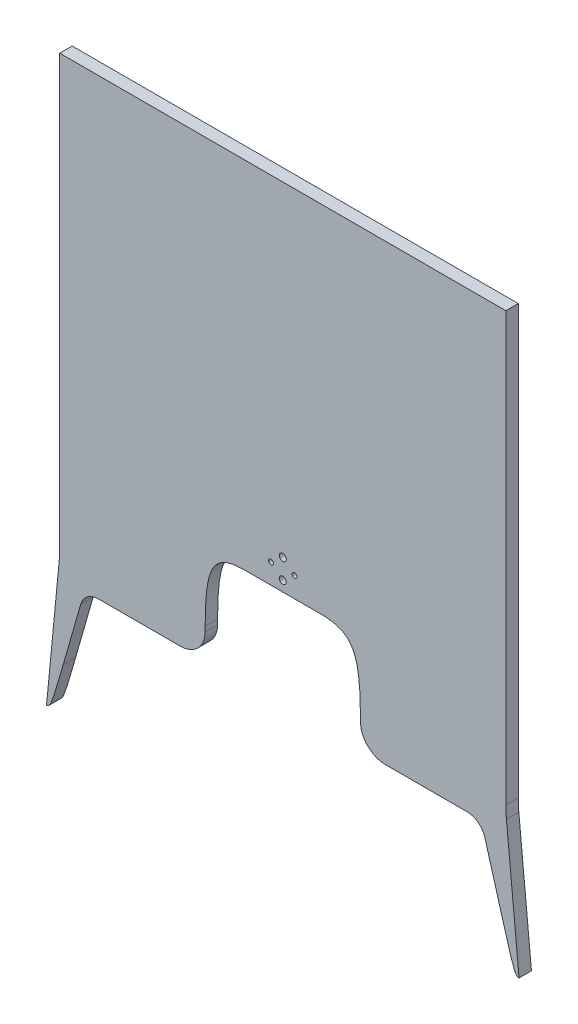
ISO-10303-21;
HEADER;
FILE_DESCRIPTION(('STEP AP214'),'2;1');
FILE_NAME('part.step','',(''),(''),'','','');
FILE_SCHEMA(('AUTOMOTIVE_DESIGN { 1 0 10303 214 1 1 1 1 }'));
ENDSEC;
DATA;
#1=APPLICATION_CONTEXT('core data for automotive mechanical design processes');
#2=APPLICATION_PROTOCOL_DEFINITION('international standard','automotive_design',2000,#1);
#3=PRODUCT_CONTEXT('',#1,'mechanical');
#4=PRODUCT('Part','Part','',(#3));
#5=PRODUCT_RELATED_PRODUCT_CATEGORY('part','',(#4));
#6=PRODUCT_DEFINITION_FORMATION('','',#4);
#7=PRODUCT_DEFINITION_CONTEXT('part definition',#1,'design');
#8=PRODUCT_DEFINITION('design','',#6,#7);
#9=PRODUCT_DEFINITION_SHAPE('','',#8);
#10=(LENGTH_UNIT() NAMED_UNIT(*) SI_UNIT(.MILLI.,.METRE.));
#11=(NAMED_UNIT(*) PLANE_ANGLE_UNIT() SI_UNIT($,.RADIAN.));
#12=(NAMED_UNIT(*) SI_UNIT($,.STERADIAN.) SOLID_ANGLE_UNIT());
#13=UNCERTAINTY_MEASURE_WITH_UNIT(LENGTH_MEASURE(1.E-05),#10,'distance_accuracy_value','');
#14=(GEOMETRIC_REPRESENTATION_CONTEXT(3) GLOBAL_UNCERTAINTY_ASSIGNED_CONTEXT((#13)) GLOBAL_UNIT_ASSIGNED_CONTEXT((#10,
#11,#12)) REPRESENTATION_CONTEXT('',''));
#15=CARTESIAN_POINT('',(0.,0.,0.));
#16=DIRECTION('',(0.,0.,1.));
#17=DIRECTION('',(1.,0.,0.));
#18=AXIS2_PLACEMENT_3D('',#15,#16,#17);
#19=CARTESIAN_POINT('',(-228.088766336441,-443.87899791618,12.7));
#20=DIRECTION('',(1.,0.,0.));
#21=DIRECTION('',(0.,0.,-1.));
#22=AXIS2_PLACEMENT_3D('',#19,#20,#21);
#23=PLANE('',#22);
#24=DIRECTION('',(0.,-1.,0.));
#25=VECTOR('',#24,1.);
#26=CARTESIAN_POINT('',(-228.088766336441,-443.87899791618,0.));
#27=LINE('',#26,#25);
#28=CARTESIAN_POINT('',(-228.088766336441,1.77635683940025E-12,0.));
#29=VERTEX_POINT('',#28);
#30=CARTESIAN_POINT('',(-228.088766336441,-437.778750466561,0.));
#31=VERTEX_POINT('',#30);
#32=EDGE_CURVE('E532',#29,#31,#27,.T.);
#33=ORIENTED_EDGE('',*,*,#32,.T.);
#34=DIRECTION('',(0.,0.,-1.));
#35=VECTOR('',#34,1.);
#36=CARTESIAN_POINT('',(-228.088766336441,-437.778750466561,12.7));
#37=LINE('',#36,#35);
#38=CARTESIAN_POINT('',(-228.088766336441,-437.778750466561,12.7));
#39=VERTEX_POINT('',#38);
#40=EDGE_CURVE('E57',#31,#39,#37,.F.);
#41=ORIENTED_EDGE('',*,*,#40,.T.);
#42=DIRECTION('',(0.,-1.,0.));
#43=VECTOR('',#42,1.);
#44=CARTESIAN_POINT('',(-228.088766336441,-443.87899791618,12.7));
#45=LINE('',#44,#43);
#46=CARTESIAN_POINT('',(-228.088766336441,1.77635683940025E-12,12.7));
#47=VERTEX_POINT('',#46);
#48=EDGE_CURVE('E691',#47,#39,#45,.T.);
#49=ORIENTED_EDGE('',*,*,#48,.F.);
#50=DIRECTION('',(0.,0.,-1.));
#51=VECTOR('',#50,1.);
#52=CARTESIAN_POINT('',(-228.088766336441,1.77635683940025E-12,12.7));
#53=LINE('',#52,#51);
#54=EDGE_CURVE('E687',#47,#29,#53,.T.);
#55=ORIENTED_EDGE('',*,*,#54,.T.);
#56=EDGE_LOOP('',(#33,#41,#49,#55));
#57=FACE_BOUND('',#56,.T.);
#58=ADVANCED_FACE('F39',(#57),#23,.F.);
#59=CARTESIAN_POINT('',(-241.600142069217,-584.200000000001,12.7));
#60=DIRECTION('',(0.995396198367179,-0.0958457525202232,0.));
#61=DIRECTION('',(0.0958457525202232,0.995396198367179,0.));
#62=AXIS2_PLACEMENT_3D('',#59,#60,#61);
#63=PLANE('',#62);
#64=DIRECTION('',(-0.0958457525202232,-0.995396198367179,0.));
#65=VECTOR('',#64,1.);
#66=CARTESIAN_POINT('',(-241.600142069217,-584.200000000001,12.7));
#67=LINE('',#66,#65);
#68=CARTESIAN_POINT('',(-228.673449143809,-449.951161036629,12.7));
#69=VERTEX_POINT('',#68);
#70=CARTESIAN_POINT('',(-241.600142069217,-584.200000000001,12.7));
#71=VERTEX_POINT('',#70);
#72=EDGE_CURVE('E533',#69,#71,#67,.T.);
#73=ORIENTED_EDGE('',*,*,#72,.F.);
#74=DIRECTION('',(0.,0.,-1.));
#75=VECTOR('',#74,1.);
#76=CARTESIAN_POINT('',(-228.673449143809,-449.951161036629,0.));
#77=LINE('',#76,#75);
#78=CARTESIAN_POINT('',(-228.673449143809,-449.951161036629,0.));
#79=VERTEX_POINT('',#78);
#80=EDGE_CURVE('E579',#69,#79,#77,.T.);
#81=ORIENTED_EDGE('',*,*,#80,.T.);
#82=DIRECTION('',(-0.0958457525202232,-0.995396198367179,0.));
#83=VECTOR('',#82,1.);
#84=CARTESIAN_POINT('',(-241.600142069217,-584.200000000001,0.));
#85=LINE('',#84,#83);
#86=CARTESIAN_POINT('',(-241.600142069217,-584.200000000001,0.));
#87=VERTEX_POINT('',#86);
#88=EDGE_CURVE('E523',#79,#87,#85,.T.);
#89=ORIENTED_EDGE('',*,*,#88,.T.);
#90=CARTESIAN_POINT('',(-241.600142069217,-584.200000000001,13.335));
#91=CARTESIAN_POINT('',(-241.600142069217,-584.200000000001,8.67833333333333));
#92=CARTESIAN_POINT('',(-241.600142069217,-584.200000000001,4.02166666666667));
#93=CARTESIAN_POINT('',(-241.600142069217,-584.200000000001,-0.634999999999999));
#94=(BOUNDED_CURVE() B_SPLINE_CURVE(3,(#90,#91,#92,#93),.UNSPECIFIED.,.F.,
.F.) B_SPLINE_CURVE_WITH_KNOTS((4,4),(-0.000635,0.013335),
.UNSPECIFIED.) CURVE() GEOMETRIC_REPRESENTATION_ITEM() RATIONAL_B_SPLINE_CURVE((1.00000000000001,
1.00000000000001,1.00000000000001,1.00000000000001)) REPRESENTATION_ITEM(''));
#95=EDGE_CURVE('E518',#71,#87,#94,.T.);
#96=ORIENTED_EDGE('',*,*,#95,.F.);
#97=EDGE_LOOP('',(#73,#81,#89,#96));
#98=FACE_BOUND('',#97,.T.);
#99=ADVANCED_FACE('F395',(#98),#63,.F.);
#100=CARTESIAN_POINT('',(-237.284597128241,-584.2,12.7));
#101=DIRECTION('',(-0.96126169593832,0.275637355816996,0.));
#102=DIRECTION('',(-0.275637355816996,-0.96126169593832,0.));
#103=AXIS2_PLACEMENT_3D('',#100,#101,#102);
#104=PLANE('',#103);
#105=DIRECTION('',(0.275637355816996,0.96126169593832,0.));
#106=VECTOR('',#105,1.);
#107=CARTESIAN_POINT('',(-237.284597128241,-584.2,12.7));
#108=LINE('',#107,#106);
#109=CARTESIAN_POINT('',(-224.526592014839,-539.707548692925,12.7));
#110=VERTEX_POINT('',#109);
#111=CARTESIAN_POINT('',(-206.645596989608,-477.349108371686,12.7));
#112=VERTEX_POINT('',#111);
#113=EDGE_CURVE('E603',#110,#112,#108,.T.);
#114=ORIENTED_EDGE('',*,*,#113,.F.);
#115=CARTESIAN_POINT('',(-224.526592014839,-539.707548692925,-0.634999999999998));
#116=CARTESIAN_POINT('',(-224.526592014839,-539.707548692925,4.02166666666667));
#117=CARTESIAN_POINT('',(-224.526592014839,-539.707548692925,8.67833333333333));
#118=CARTESIAN_POINT('',(-224.526592014839,-539.707548692925,13.335));
#119=(BOUNDED_CURVE() B_SPLINE_CURVE(3,(#115,#116,#117,#118),.UNSPECIFIED.,.F.,
.F.) B_SPLINE_CURVE_WITH_KNOTS((4,4),(-0.000635,0.013335),
.UNSPECIFIED.) CURVE() GEOMETRIC_REPRESENTATION_ITEM() RATIONAL_B_SPLINE_CURVE((1.,1.,1.,1.)) REPRESENTATION_ITEM(''));
#120=CARTESIAN_POINT('',(-224.526592014839,-539.707548692925,0.));
#121=VERTEX_POINT('',#120);
#122=EDGE_CURVE('E584',#110,#121,#119,.F.);
#123=ORIENTED_EDGE('',*,*,#122,.T.);
#124=DIRECTION('',(0.275637355816996,0.96126169593832,0.));
#125=VECTOR('',#124,1.);
#126=CARTESIAN_POINT('',(-237.284597128241,-584.2,0.));
#127=LINE('',#126,#125);
#128=CARTESIAN_POINT('',(-206.645596989608,-477.349108371686,0.));
#129=VERTEX_POINT('',#128);
#130=EDGE_CURVE('E531',#121,#129,#127,.T.);
#131=ORIENTED_EDGE('',*,*,#130,.T.);
#132=DIRECTION('',(0.,0.,-1.));
#133=VECTOR('',#132,1.);
#134=CARTESIAN_POINT('',(-206.645596989608,-477.349108371686,12.7));
#135=LINE('',#134,#133);
#136=EDGE_CURVE('E596',#129,#112,#135,.F.);
#137=ORIENTED_EDGE('',*,*,#136,.T.);
#138=EDGE_LOOP('',(#114,#123,#131,#137));
#139=FACE_BOUND('',#138,.T.);
#140=ADVANCED_FACE('F400',(#139),#104,.F.);
#141=CARTESIAN_POINT('',(-202.688766336441,-463.55,12.7));
#142=DIRECTION('',(0.,1.,0.));
#143=DIRECTION('',(0.,0.,1.));
#144=AXIS2_PLACEMENT_3D('',#141,#142,#143);
#145=PLANE('',#144);
#146=DIRECTION('',(1.,0.,0.));
#147=VECTOR('',#146,1.);
#148=CARTESIAN_POINT('',(-202.688766336441,-463.55,12.7));
#149=LINE('',#148,#147);
#150=CARTESIAN_POINT('',(-188.333561681983,-463.55,12.7));
#151=VERTEX_POINT('',#150);
#152=CARTESIAN_POINT('',(-104.775,-463.55,12.7));
#153=VERTEX_POINT('',#152);
#154=EDGE_CURVE('E621',#151,#153,#149,.T.);
#155=ORIENTED_EDGE('',*,*,#154,.F.);
#156=DIRECTION('',(0.,0.,-1.));
#157=VECTOR('',#156,1.);
#158=CARTESIAN_POINT('',(-188.333561681983,-463.55,0.));
#159=LINE('',#158,#157);
#160=CARTESIAN_POINT('',(-188.333561681983,-463.55,0.));
#161=VERTEX_POINT('',#160);
#162=EDGE_CURVE('E1013',#151,#161,#159,.T.);
#163=ORIENTED_EDGE('',*,*,#162,.T.);
#164=DIRECTION('',(1.,0.,0.));
#165=VECTOR('',#164,1.);
#166=CARTESIAN_POINT('',(-202.688766336441,-463.55,0.));
#167=LINE('',#166,#165);
#168=CARTESIAN_POINT('',(-104.775,-463.55,0.));
#169=VERTEX_POINT('',#168);
#170=EDGE_CURVE('E602',#161,#169,#167,.T.);
#171=ORIENTED_EDGE('',*,*,#170,.T.);
#172=DIRECTION('',(0.,0.,-1.));
#173=VECTOR('',#172,1.);
#174=CARTESIAN_POINT('',(-104.775,-463.55,12.7));
#175=LINE('',#174,#173);
#176=EDGE_CURVE('E1006',#169,#153,#175,.F.);
#177=ORIENTED_EDGE('',*,*,#176,.T.);
#178=EDGE_LOOP('',(#155,#163,#171,#177));
#179=FACE_BOUND('',#178,.T.);
#180=ADVANCED_FACE('F659',(#179),#145,.F.);
#181=CARTESIAN_POINT('',(-79.375,-363.22,12.7));
#182=DIRECTION('',(-1.,0.,0.));
#183=DIRECTION('',(0.,-1.,0.));
#184=AXIS2_PLACEMENT_3D('',#181,#182,#183);
#185=PLANE('',#184);
#186=DIRECTION('',(0.,1.,0.));
#187=VECTOR('',#186,1.);
#188=CARTESIAN_POINT('',(-79.375,-363.22,12.7));
#189=LINE('',#188,#187);
#190=CARTESIAN_POINT('',(-79.375,-438.15,12.7));
#191=VERTEX_POINT('',#190);
#192=CARTESIAN_POINT('',(-79.375,-433.07,12.7));
#193=VERTEX_POINT('',#192);
#194=EDGE_CURVE('E617',#191,#193,#189,.T.);
#195=ORIENTED_EDGE('',*,*,#194,.F.);
#196=DIRECTION('',(0.,0.,-1.));
#197=VECTOR('',#196,1.);
#198=CARTESIAN_POINT('',(-79.375,-438.15,12.7));
#199=LINE('',#198,#197);
#200=CARTESIAN_POINT('',(-79.375,-438.15,0.));
#201=VERTEX_POINT('',#200);
#202=EDGE_CURVE('E622',#191,#201,#199,.T.);
#203=ORIENTED_EDGE('',*,*,#202,.T.);
#204=DIRECTION('',(0.,1.,0.));
#205=VECTOR('',#204,1.);
#206=CARTESIAN_POINT('',(-79.375,-363.22,0.));
#207=LINE('',#206,#205);
#208=CARTESIAN_POINT('',(-79.375,-433.07,0.));
#209=VERTEX_POINT('',#208);
#210=EDGE_CURVE('E610',#201,#209,#207,.T.);
#211=ORIENTED_EDGE('',*,*,#210,.T.);
#212=CARTESIAN_POINT('',(-79.375,-433.07,13.335));
#213=CARTESIAN_POINT('',(-79.375,-433.07,8.67833333333334));
#214=CARTESIAN_POINT('',(-79.375,-433.07,4.02166666666666));
#215=CARTESIAN_POINT('',(-79.375,-433.07,-0.635));
#216=(BOUNDED_CURVE() B_SPLINE_CURVE(3,(#212,#213,#214,#215),.UNSPECIFIED.,.F.,
.F.) B_SPLINE_CURVE_WITH_KNOTS((4,4),(-0.013335,0.000635),
.UNSPECIFIED.) CURVE() GEOMETRIC_REPRESENTATION_ITEM() RATIONAL_B_SPLINE_CURVE((1.,1.,1.,1.)) REPRESENTATION_ITEM(''));
#217=EDGE_CURVE('E686',#209,#193,#216,.F.);
#218=ORIENTED_EDGE('',*,*,#217,.T.);
#219=EDGE_LOOP('',(#195,#203,#211,#218));
#220=FACE_BOUND('',#219,.T.);
#221=ADVANCED_FACE('F654',(#220),#185,.F.);
#222=CARTESIAN_POINT('',(79.375,-363.22,12.7));
#223=DIRECTION('',(0.,1.,0.));
#224=DIRECTION('',(0.,0.,1.));
#225=AXIS2_PLACEMENT_3D('',#222,#223,#224);
#226=PLANE('',#225);
#227=DIRECTION('',(1.,0.,0.));
#228=VECTOR('',#227,1.);
#229=CARTESIAN_POINT('',(79.375,-363.22,0.));
#230=LINE('',#229,#228);
#231=CARTESIAN_POINT('',(-38.0999999999999,-363.22,0.));
#232=VERTEX_POINT('',#231);
#233=CARTESIAN_POINT('',(38.0999999999999,-363.22,0.));
#234=VERTEX_POINT('',#233);
#235=EDGE_CURVE('E616',#232,#234,#230,.T.);
#236=ORIENTED_EDGE('',*,*,#235,.T.);
#237=CARTESIAN_POINT('',(38.1,-363.22,13.335));
#238=CARTESIAN_POINT('',(38.1,-363.22,8.67833333333334));
#239=CARTESIAN_POINT('',(38.1,-363.22,4.02166666666666));
#240=CARTESIAN_POINT('',(38.1,-363.22,-0.635));
#241=(BOUNDED_CURVE() B_SPLINE_CURVE(3,(#237,#238,#239,#240),.UNSPECIFIED.,.F.,
.F.) B_SPLINE_CURVE_WITH_KNOTS((4,4),(-0.013335,0.000635),
.UNSPECIFIED.) CURVE() GEOMETRIC_REPRESENTATION_ITEM() RATIONAL_B_SPLINE_CURVE((1.,1.,1.,1.)) REPRESENTATION_ITEM(''));
#242=CARTESIAN_POINT('',(38.0999999999999,-363.22,12.7));
#243=VERTEX_POINT('',#242);
#244=EDGE_CURVE('E216',#243,#234,#241,.T.);
#245=ORIENTED_EDGE('',*,*,#244,.F.);
#246=DIRECTION('',(1.,0.,0.));
#247=VECTOR('',#246,1.);
#248=CARTESIAN_POINT('',(79.375,-363.22,12.7));
#249=LINE('',#248,#247);
#250=CARTESIAN_POINT('',(-38.0999999999999,-363.22,12.7));
#251=VERTEX_POINT('',#250);
#252=EDGE_CURVE('E620',#251,#243,#249,.T.);
#253=ORIENTED_EDGE('',*,*,#252,.F.);
#254=CARTESIAN_POINT('',(-38.1,-363.22,-0.635));
#255=CARTESIAN_POINT('',(-38.1,-363.22,4.02166666666666));
#256=CARTESIAN_POINT('',(-38.1,-363.22,8.67833333333334));
#257=CARTESIAN_POINT('',(-38.1,-363.22,13.335));
#258=(BOUNDED_CURVE() B_SPLINE_CURVE(3,(#254,#255,#256,#257),.UNSPECIFIED.,.F.,
.F.) B_SPLINE_CURVE_WITH_KNOTS((4,4),(-0.013335,0.000635),
.UNSPECIFIED.) CURVE() GEOMETRIC_REPRESENTATION_ITEM() RATIONAL_B_SPLINE_CURVE((1.,1.,1.,1.)) REPRESENTATION_ITEM(''));
#259=EDGE_CURVE('E638',#251,#232,#258,.F.);
#260=ORIENTED_EDGE('',*,*,#259,.T.);
#261=EDGE_LOOP('',(#236,#245,#253,#260));
#262=FACE_BOUND('',#261,.T.);
#263=ADVANCED_FACE('F645',(#262),#226,.F.);
#264=CARTESIAN_POINT('',(-228.088766336441,1.77635683940025E-12,12.7));
#265=DIRECTION('',(0.,-1.,0.));
#266=DIRECTION('',(0.,0.,-1.));
#267=AXIS2_PLACEMENT_3D('',#264,#265,#266);
#268=PLANE('',#267);
#269=DIRECTION('',(-1.,0.,0.));
#270=VECTOR('',#269,1.);
#271=CARTESIAN_POINT('',(-228.088766336441,1.77635683940025E-12,12.7));
#272=LINE('',#271,#270);
#273=CARTESIAN_POINT('',(228.088766336441,1.77635683940025E-12,12.7));
#274=VERTEX_POINT('',#273);
#275=EDGE_CURVE('E628',#274,#47,#272,.T.);
#276=ORIENTED_EDGE('',*,*,#275,.F.);
#277=DIRECTION('',(0.,0.,-1.));
#278=VECTOR('',#277,1.);
#279=CARTESIAN_POINT('',(228.088766336441,1.77635683940025E-12,12.7));
#280=LINE('',#279,#278);
#281=CARTESIAN_POINT('',(228.088766336441,1.77635683940025E-12,0.));
#282=VERTEX_POINT('',#281);
#283=EDGE_CURVE('E217',#274,#282,#280,.T.);
#284=ORIENTED_EDGE('',*,*,#283,.T.);
#285=DIRECTION('',(-1.,0.,0.));
#286=VECTOR('',#285,1.);
#287=CARTESIAN_POINT('',(-228.088766336441,1.77635683940025E-12,0.));
#288=LINE('',#287,#286);
#289=EDGE_CURVE('E690',#282,#29,#288,.T.);
#290=ORIENTED_EDGE('',*,*,#289,.T.);
#291=ORIENTED_EDGE('',*,*,#54,.F.);
#292=EDGE_LOOP('',(#276,#284,#290,#291));
#293=FACE_BOUND('',#292,.T.);
#294=ADVANCED_FACE('F556',(#293),#268,.F.);
#295=CARTESIAN_POINT('',(0.,0.,12.7));
#296=DIRECTION('',(0.,0.,-1.));
#297=DIRECTION('',(-1.,0.,0.));
#298=AXIS2_PLACEMENT_3D('',#295,#296,#297);
#299=PLANE('',#298);
#300=CARTESIAN_POINT('',(-4.30211422042248E-13,-352.742500000001,12.7));
#301=DIRECTION('',(0.,0.,-1.));
#302=DIRECTION('',(-1.,0.,0.));
#303=AXIS2_PLACEMENT_3D('',#300,#301,#302);
#304=CIRCLE('',#303,3.57124);
#305=CARTESIAN_POINT('',(-3.57124000000043,-352.742500000001,12.7));
#306=VERTEX_POINT('',#305);
#307=EDGE_CURVE('E752',#306,#306,#304,.T.);
#308=ORIENTED_EDGE('',*,*,#307,.T.);
#309=EDGE_LOOP('',(#308));
#310=FACE_BOUND('',#309,.T.);
#311=CARTESIAN_POINT('',(-5.68989300120393E-13,-332.4225,12.7));
#312=DIRECTION('',(0.,0.,-1.));
#313=DIRECTION('',(-1.,0.,0.));
#314=AXIS2_PLACEMENT_3D('',#311,#312,#313);
#315=CIRCLE('',#314,3.57124);
#316=CARTESIAN_POINT('',(-3.57124000000057,-332.4225,12.7));
#317=VERTEX_POINT('',#316);
#318=EDGE_CURVE('E746',#317,#317,#315,.T.);
#319=ORIENTED_EDGE('',*,*,#318,.T.);
#320=EDGE_LOOP('',(#319));
#321=FACE_BOUND('',#320,.T.);
#322=CARTESIAN_POINT('',(-12.0772160579066,-342.582499999992,12.7));
#323=DIRECTION('',(0.,0.,-1.));
#324=DIRECTION('',(-1.,0.,0.));
#325=AXIS2_PLACEMENT_3D('',#322,#323,#324);
#326=CIRCLE('',#325,2.45744999999999);
#327=CARTESIAN_POINT('',(-14.5346660579065,-342.582499999992,12.7));
#328=VERTEX_POINT('',#327);
#329=EDGE_CURVE('E740',#328,#328,#326,.T.);
#330=ORIENTED_EDGE('',*,*,#329,.T.);
#331=EDGE_LOOP('',(#330));
#332=FACE_BOUND('',#331,.T.);
#333=CARTESIAN_POINT('',(12.0772160579066,-342.582499999992,12.7));
#334=DIRECTION('',(0.,0.,-1.));
#335=DIRECTION('',(-1.,0.,0.));
#336=AXIS2_PLACEMENT_3D('',#333,#334,#335);
#337=CIRCLE('',#336,2.45744999999999);
#338=CARTESIAN_POINT('',(9.61976605790659,-342.582499999992,12.7));
#339=VERTEX_POINT('',#338);
#340=EDGE_CURVE('E730',#339,#339,#337,.T.);
#341=ORIENTED_EDGE('',*,*,#340,.T.);
#342=EDGE_LOOP('',(#341));
#343=FACE_BOUND('',#342,.T.);
#344=ORIENTED_EDGE('',*,*,#252,.T.);
#345=CARTESIAN_POINT('',(79.375,-433.07,12.7));
#346=CARTESIAN_POINT('',(79.3749999999999,-363.22,12.7));
#347=CARTESIAN_POINT('',(38.1,-363.22,12.7));
#348=(BOUNDED_CURVE() B_SPLINE_CURVE(2,(#345,#346,#347),.UNSPECIFIED.,.F.,
.F.) B_SPLINE_CURVE_WITH_KNOTS((3,3),(0.,1.),
.UNSPECIFIED.) CURVE() GEOMETRIC_REPRESENTATION_ITEM() RATIONAL_B_SPLINE_CURVE((1.,1.5,1.)) REPRESENTATION_ITEM(''));
#349=CARTESIAN_POINT('',(79.375,-433.07,12.7));
#350=VERTEX_POINT('',#349);
#351=EDGE_CURVE('E576',#350,#243,#348,.T.);
#352=ORIENTED_EDGE('',*,*,#351,.F.);
#353=DIRECTION('',(0.,1.,0.));
#354=VECTOR('',#353,1.);
#355=CARTESIAN_POINT('',(79.375,-363.22,12.7));
#356=LINE('',#355,#354);
#357=CARTESIAN_POINT('',(79.375,-438.15,12.7));
#358=VERTEX_POINT('',#357);
#359=EDGE_CURVE('E361',#358,#350,#356,.T.);
#360=ORIENTED_EDGE('',*,*,#359,.F.);
#361=CARTESIAN_POINT('',(104.775,-438.15,12.7));
#362=DIRECTION('',(0.,0.,1.));
#363=DIRECTION('',(1.,0.,0.));
#364=AXIS2_PLACEMENT_3D('',#361,#362,#363);
#365=CIRCLE('',#364,25.4);
#366=CARTESIAN_POINT('',(104.775,-463.55,12.7));
#367=VERTEX_POINT('',#366);
#368=EDGE_CURVE('E709',#367,#358,#365,.F.);
#369=ORIENTED_EDGE('',*,*,#368,.F.);
#370=DIRECTION('',(-1.,0.,0.));
#371=VECTOR('',#370,1.);
#372=CARTESIAN_POINT('',(202.688766336441,-463.55,12.7));
#373=LINE('',#372,#371);
#374=CARTESIAN_POINT('',(188.333561681983,-463.55,12.7));
#375=VERTEX_POINT('',#374);
#376=EDGE_CURVE('E225',#375,#367,#373,.T.);
#377=ORIENTED_EDGE('',*,*,#376,.F.);
#378=CARTESIAN_POINT('',(188.333561681983,-482.6,12.7));
#379=DIRECTION('',(0.,0.,1.));
#380=DIRECTION('',(1.,0.,0.));
#381=AXIS2_PLACEMENT_3D('',#378,#379,#380);
#382=CIRCLE('',#381,19.05);
#383=CARTESIAN_POINT('',(206.645596989608,-477.349108371686,12.7));
#384=VERTEX_POINT('',#383);
#385=EDGE_CURVE('E719',#384,#375,#382,.T.);
#386=ORIENTED_EDGE('',*,*,#385,.F.);
#387=DIRECTION('',(-0.275637355816996,0.96126169593832,0.));
#388=VECTOR('',#387,1.);
#389=CARTESIAN_POINT('',(237.284597128241,-584.2,12.7));
#390=LINE('',#389,#388);
#391=CARTESIAN_POINT('',(224.526592014839,-539.707548692925,12.7));
#392=VERTEX_POINT('',#391);
#393=EDGE_CURVE('E198',#392,#384,#390,.T.);
#394=ORIENTED_EDGE('',*,*,#393,.F.);
#395=CARTESIAN_POINT('',(241.600142069217,-584.200000000001,12.7));
#396=CARTESIAN_POINT('',(237.17709531777,-583.825096633425,12.7));
#397=CARTESIAN_POINT('',(224.526592014839,-539.707548692925,12.7));
#398=(BOUNDED_CURVE() B_SPLINE_CURVE(2,(#395,#396,#397),.UNSPECIFIED.,.F.,
.F.) B_SPLINE_CURVE_WITH_KNOTS((3,3),(0.,1.),
.UNSPECIFIED.) CURVE() GEOMETRIC_REPRESENTATION_ITEM() RATIONAL_B_SPLINE_CURVE((1.,
2.33333333333334,1.)) REPRESENTATION_ITEM(''));
#399=CARTESIAN_POINT('',(241.600142069217,-584.200000000001,12.7));
#400=VERTEX_POINT('',#399);
#401=EDGE_CURVE('E191',#400,#392,#398,.T.);
#402=ORIENTED_EDGE('',*,*,#401,.F.);
#403=DIRECTION('',(0.0958457525202232,-0.995396198367179,0.));
#404=VECTOR('',#403,1.);
#405=CARTESIAN_POINT('',(241.600142069217,-584.200000000001,12.7));
#406=LINE('',#405,#404);
#407=CARTESIAN_POINT('',(228.673449143809,-449.951161036629,12.7));
#408=VERTEX_POINT('',#407);
#409=EDGE_CURVE('E196',#408,#400,#406,.T.);
#410=ORIENTED_EDGE('',*,*,#409,.F.);
#411=CARTESIAN_POINT('',(355.088766336441,-437.778750466561,12.7));
#412=DIRECTION('',(0.,0.,1.));
#413=DIRECTION('',(1.,0.,0.));
#414=AXIS2_PLACEMENT_3D('',#411,#412,#413);
#415=CIRCLE('',#414,127.);
#416=CARTESIAN_POINT('',(228.088766336441,-437.778750466561,12.7));
#417=VERTEX_POINT('',#416);
#418=EDGE_CURVE('E784',#417,#408,#415,.T.);
#419=ORIENTED_EDGE('',*,*,#418,.F.);
#420=DIRECTION('',(0.,-1.,0.));
#421=VECTOR('',#420,1.);
#422=CARTESIAN_POINT('',(228.088766336441,-443.87899791618,12.7));
#423=LINE('',#422,#421);
#424=EDGE_CURVE('E223',#274,#417,#423,.T.);
#425=ORIENTED_EDGE('',*,*,#424,.F.);
#426=ORIENTED_EDGE('',*,*,#275,.T.);
#427=ORIENTED_EDGE('',*,*,#48,.T.);
#428=CARTESIAN_POINT('',(-355.088766336441,-437.778750466561,12.7));
#429=DIRECTION('',(0.,0.,-1.));
#430=DIRECTION('',(-1.,0.,0.));
#431=AXIS2_PLACEMENT_3D('',#428,#429,#430);
#432=CIRCLE('',#431,127.);
#433=EDGE_CURVE('E12',#39,#69,#432,.T.);
#434=ORIENTED_EDGE('',*,*,#433,.T.);
#435=ORIENTED_EDGE('',*,*,#72,.T.);
#436=CARTESIAN_POINT('',(-224.526592014839,-539.707548692925,12.7));
#437=CARTESIAN_POINT('',(-237.17709531777,-583.825096633425,12.7));
#438=CARTESIAN_POINT('',(-241.600142069217,-584.200000000001,12.7));
#439=(BOUNDED_CURVE() B_SPLINE_CURVE(2,(#436,#437,#438),.UNSPECIFIED.,.F.,
.F.) B_SPLINE_CURVE_WITH_KNOTS((3,3),(0.,1.),
.UNSPECIFIED.) CURVE() GEOMETRIC_REPRESENTATION_ITEM() RATIONAL_B_SPLINE_CURVE((1.,
2.33333333333334,1.)) REPRESENTATION_ITEM(''));
#440=EDGE_CURVE('E544',#71,#110,#439,.F.);
#441=ORIENTED_EDGE('',*,*,#440,.T.);
#442=ORIENTED_EDGE('',*,*,#113,.T.);
#443=CARTESIAN_POINT('',(-188.333561681983,-482.6,12.7));
#444=DIRECTION('',(0.,0.,-1.));
#445=DIRECTION('',(-1.,0.,0.));
#446=AXIS2_PLACEMENT_3D('',#443,#444,#445);
#447=CIRCLE('',#446,19.05);
#448=EDGE_CURVE('E587',#112,#151,#447,.T.);
#449=ORIENTED_EDGE('',*,*,#448,.T.);
#450=ORIENTED_EDGE('',*,*,#154,.T.);
#451=CARTESIAN_POINT('',(-104.775,-438.15,12.7));
#452=DIRECTION('',(0.,0.,-1.));
#453=DIRECTION('',(-1.,0.,0.));
#454=AXIS2_PLACEMENT_3D('',#451,#452,#453);
#455=CIRCLE('',#454,25.4);
#456=EDGE_CURVE('E1002',#153,#191,#455,.F.);
#457=ORIENTED_EDGE('',*,*,#456,.T.);
#458=ORIENTED_EDGE('',*,*,#194,.T.);
#459=CARTESIAN_POINT('',(-38.1,-363.22,12.7));
#460=CARTESIAN_POINT('',(-79.3749999999999,-363.22,12.7));
#461=CARTESIAN_POINT('',(-79.375,-433.07,12.7));
#462=(BOUNDED_CURVE() B_SPLINE_CURVE(2,(#459,#460,#461),.UNSPECIFIED.,.F.,
.F.) B_SPLINE_CURVE_WITH_KNOTS((3,3),(0.,1.),
.UNSPECIFIED.) CURVE() GEOMETRIC_REPRESENTATION_ITEM() RATIONAL_B_SPLINE_CURVE((1.,1.5,1.)) REPRESENTATION_ITEM(''));
#463=EDGE_CURVE('E682',#193,#251,#462,.F.);
#464=ORIENTED_EDGE('',*,*,#463,.T.);
#465=EDGE_LOOP('',(#344,#352,#360,#369,#377,#386,#394,#402,#410,#419,#425,#426,#427,#434,#435,
#441,#442,#449,#450,#457,#458,#464));
#466=FACE_BOUND('',#465,.T.);
#467=ADVANCED_FACE('F194',(#310,#321,#332,#343,#466),#299,.F.);
#468=CARTESIAN_POINT('',(0.,0.,0.));
#469=DIRECTION('',(0.,0.,-1.));
#470=DIRECTION('',(-1.,0.,0.));
#471=AXIS2_PLACEMENT_3D('',#468,#469,#470);
#472=PLANE('',#471);
#473=CARTESIAN_POINT('',(-4.30211422042248E-13,-352.742500000001,0.));
#474=DIRECTION('',(0.,0.,-1.));
#475=DIRECTION('',(-1.,0.,0.));
#476=AXIS2_PLACEMENT_3D('',#473,#474,#475);
#477=CIRCLE('',#476,3.57124);
#478=CARTESIAN_POINT('',(-3.57124000000043,-352.742500000001,0.));
#479=VERTEX_POINT('',#478);
#480=EDGE_CURVE('E755',#479,#479,#477,.T.);
#481=ORIENTED_EDGE('',*,*,#480,.F.);
#482=EDGE_LOOP('',(#481));
#483=FACE_BOUND('',#482,.T.);
#484=CARTESIAN_POINT('',(-5.68989300120393E-13,-332.4225,0.));
#485=DIRECTION('',(0.,0.,-1.));
#486=DIRECTION('',(-1.,0.,0.));
#487=AXIS2_PLACEMENT_3D('',#484,#485,#486);
#488=CIRCLE('',#487,3.57124);
#489=CARTESIAN_POINT('',(-3.57124000000057,-332.4225,0.));
#490=VERTEX_POINT('',#489);
#491=EDGE_CURVE('E749',#490,#490,#488,.T.);
#492=ORIENTED_EDGE('',*,*,#491,.F.);
#493=EDGE_LOOP('',(#492));
#494=FACE_BOUND('',#493,.T.);
#495=CARTESIAN_POINT('',(-12.0772160579066,-342.582499999992,0.));
#496=DIRECTION('',(0.,0.,-1.));
#497=DIRECTION('',(-1.,0.,0.));
#498=AXIS2_PLACEMENT_3D('',#495,#496,#497);
#499=CIRCLE('',#498,2.45744999999999);
#500=CARTESIAN_POINT('',(-14.5346660579065,-342.582499999992,0.));
#501=VERTEX_POINT('',#500);
#502=EDGE_CURVE('E743',#501,#501,#499,.T.);
#503=ORIENTED_EDGE('',*,*,#502,.F.);
#504=EDGE_LOOP('',(#503));
#505=FACE_BOUND('',#504,.T.);
#506=CARTESIAN_POINT('',(12.0772160579066,-342.582499999992,0.));
#507=DIRECTION('',(0.,0.,-1.));
#508=DIRECTION('',(-1.,0.,0.));
#509=AXIS2_PLACEMENT_3D('',#506,#507,#508);
#510=CIRCLE('',#509,2.45744999999999);
#511=CARTESIAN_POINT('',(9.61976605790659,-342.582499999992,0.));
#512=VERTEX_POINT('',#511);
#513=EDGE_CURVE('E737',#512,#512,#510,.T.);
#514=ORIENTED_EDGE('',*,*,#513,.F.);
#515=EDGE_LOOP('',(#514));
#516=FACE_BOUND('',#515,.T.);
#517=ORIENTED_EDGE('',*,*,#289,.F.);
#518=DIRECTION('',(0.,-1.,0.));
#519=VECTOR('',#518,1.);
#520=CARTESIAN_POINT('',(228.088766336441,-443.87899791618,0.));
#521=LINE('',#520,#519);
#522=CARTESIAN_POINT('',(228.088766336441,-437.778750466561,0.));
#523=VERTEX_POINT('',#522);
#524=EDGE_CURVE('E728',#282,#523,#521,.T.);
#525=ORIENTED_EDGE('',*,*,#524,.T.);
#526=CARTESIAN_POINT('',(355.088766336441,-437.778750466561,0.));
#527=DIRECTION('',(0.,0.,1.));
#528=DIRECTION('',(1.,0.,0.));
#529=AXIS2_PLACEMENT_3D('',#526,#527,#528);
#530=CIRCLE('',#529,127.);
#531=CARTESIAN_POINT('',(228.673449143809,-449.951161036629,0.));
#532=VERTEX_POINT('',#531);
#533=EDGE_CURVE('E788',#532,#523,#530,.F.);
#534=ORIENTED_EDGE('',*,*,#533,.F.);
#535=DIRECTION('',(0.0958457525202232,-0.995396198367179,0.));
#536=VECTOR('',#535,1.);
#537=CARTESIAN_POINT('',(241.600142069217,-584.200000000001,0.));
#538=LINE('',#537,#536);
#539=CARTESIAN_POINT('',(241.600142069217,-584.200000000001,0.));
#540=VERTEX_POINT('',#539);
#541=EDGE_CURVE('E233',#532,#540,#538,.T.);
#542=ORIENTED_EDGE('',*,*,#541,.T.);
#543=CARTESIAN_POINT('',(224.526592014839,-539.707548692925,0.));
#544=CARTESIAN_POINT('',(237.17709531777,-583.825096633425,0.));
#545=CARTESIAN_POINT('',(241.600142069217,-584.200000000001,0.));
#546=(BOUNDED_CURVE() B_SPLINE_CURVE(2,(#543,#544,#545),.UNSPECIFIED.,.F.,
.F.) B_SPLINE_CURVE_WITH_KNOTS((3,3),(0.,1.),
.UNSPECIFIED.) CURVE() GEOMETRIC_REPRESENTATION_ITEM() RATIONAL_B_SPLINE_CURVE((1.,
2.33333333333334,1.)) REPRESENTATION_ITEM(''));
#547=CARTESIAN_POINT('',(224.526592014839,-539.707548692925,0.));
#548=VERTEX_POINT('',#547);
#549=EDGE_CURVE('E204',#548,#540,#546,.T.);
#550=ORIENTED_EDGE('',*,*,#549,.F.);
#551=DIRECTION('',(-0.275637355816996,0.96126169593832,0.));
#552=VECTOR('',#551,1.);
#553=CARTESIAN_POINT('',(237.284597128241,-584.2,0.));
#554=LINE('',#553,#552);
#555=CARTESIAN_POINT('',(206.645596989608,-477.349108371686,0.));
#556=VERTEX_POINT('',#555);
#557=EDGE_CURVE('E722',#548,#556,#554,.T.);
#558=ORIENTED_EDGE('',*,*,#557,.T.);
#559=CARTESIAN_POINT('',(188.333561681983,-482.6,0.));
#560=DIRECTION('',(0.,0.,1.));
#561=DIRECTION('',(1.,0.,0.));
#562=AXIS2_PLACEMENT_3D('',#559,#560,#561);
#563=CIRCLE('',#562,19.05);
#564=CARTESIAN_POINT('',(188.333561681983,-463.55,0.));
#565=VERTEX_POINT('',#564);
#566=EDGE_CURVE('E717',#565,#556,#563,.F.);
#567=ORIENTED_EDGE('',*,*,#566,.F.);
#568=DIRECTION('',(-1.,0.,0.));
#569=VECTOR('',#568,1.);
#570=CARTESIAN_POINT('',(202.688766336441,-463.55,0.));
#571=LINE('',#570,#569);
#572=CARTESIAN_POINT('',(104.775,-463.55,0.));
#573=VERTEX_POINT('',#572);
#574=EDGE_CURVE('E360',#565,#573,#571,.T.);
#575=ORIENTED_EDGE('',*,*,#574,.T.);
#576=CARTESIAN_POINT('',(104.775,-438.15,0.));
#577=DIRECTION('',(0.,0.,1.));
#578=DIRECTION('',(1.,0.,0.));
#579=AXIS2_PLACEMENT_3D('',#576,#577,#578);
#580=CIRCLE('',#579,25.4);
#581=CARTESIAN_POINT('',(79.375,-438.15,0.));
#582=VERTEX_POINT('',#581);
#583=EDGE_CURVE('E701',#582,#573,#580,.T.);
#584=ORIENTED_EDGE('',*,*,#583,.F.);
#585=DIRECTION('',(0.,1.,0.));
#586=VECTOR('',#585,1.);
#587=CARTESIAN_POINT('',(79.375,-363.22,0.));
#588=LINE('',#587,#586);
#589=CARTESIAN_POINT('',(79.375,-433.07,0.));
#590=VERTEX_POINT('',#589);
#591=EDGE_CURVE('E228',#582,#590,#588,.T.);
#592=ORIENTED_EDGE('',*,*,#591,.T.);
#593=CARTESIAN_POINT('',(38.1,-363.22,0.));
#594=CARTESIAN_POINT('',(79.3749999999999,-363.22,0.));
#595=CARTESIAN_POINT('',(79.375,-433.07,0.));
#596=(BOUNDED_CURVE() B_SPLINE_CURVE(2,(#593,#594,#595),.UNSPECIFIED.,.F.,
.F.) B_SPLINE_CURVE_WITH_KNOTS((3,3),(0.,1.),
.UNSPECIFIED.) CURVE() GEOMETRIC_REPRESENTATION_ITEM() RATIONAL_B_SPLINE_CURVE((1.,1.5,1.)) REPRESENTATION_ITEM(''));
#597=EDGE_CURVE('E695',#234,#590,#596,.T.);
#598=ORIENTED_EDGE('',*,*,#597,.F.);
#599=ORIENTED_EDGE('',*,*,#235,.F.);
#600=CARTESIAN_POINT('',(-79.375,-433.07,0.));
#601=CARTESIAN_POINT('',(-79.3749999999999,-363.22,0.));
#602=CARTESIAN_POINT('',(-38.1,-363.22,0.));
#603=(BOUNDED_CURVE() B_SPLINE_CURVE(2,(#600,#601,#602),.UNSPECIFIED.,.F.,
.F.) B_SPLINE_CURVE_WITH_KNOTS((3,3),(0.,1.),
.UNSPECIFIED.) CURVE() GEOMETRIC_REPRESENTATION_ITEM() RATIONAL_B_SPLINE_CURVE((1.,1.5,1.)) REPRESENTATION_ITEM(''));
#604=EDGE_CURVE('E672',#232,#209,#603,.F.);
#605=ORIENTED_EDGE('',*,*,#604,.T.);
#606=ORIENTED_EDGE('',*,*,#210,.F.);
#607=CARTESIAN_POINT('',(-104.775,-438.15,0.));
#608=DIRECTION('',(0.,0.,-1.));
#609=DIRECTION('',(-1.,0.,0.));
#610=AXIS2_PLACEMENT_3D('',#607,#608,#609);
#611=CIRCLE('',#610,25.4);
#612=EDGE_CURVE('E1009',#201,#169,#611,.T.);
#613=ORIENTED_EDGE('',*,*,#612,.T.);
#614=ORIENTED_EDGE('',*,*,#170,.F.);
#615=CARTESIAN_POINT('',(-188.333561681983,-482.6,0.));
#616=DIRECTION('',(0.,0.,-1.));
#617=DIRECTION('',(-1.,0.,0.));
#618=AXIS2_PLACEMENT_3D('',#615,#616,#617);
#619=CIRCLE('',#618,19.05);
#620=EDGE_CURVE('E591',#161,#129,#619,.F.);
#621=ORIENTED_EDGE('',*,*,#620,.T.);
#622=ORIENTED_EDGE('',*,*,#130,.F.);
#623=CARTESIAN_POINT('',(-241.600142069217,-584.200000000001,0.));
#624=CARTESIAN_POINT('',(-237.17709531777,-583.825096633425,0.));
#625=CARTESIAN_POINT('',(-224.526592014839,-539.707548692925,0.));
#626=(BOUNDED_CURVE() B_SPLINE_CURVE(2,(#623,#624,#625),.UNSPECIFIED.,.F.,
.F.) B_SPLINE_CURVE_WITH_KNOTS((3,3),(0.,1.),
.UNSPECIFIED.) CURVE() GEOMETRIC_REPRESENTATION_ITEM() RATIONAL_B_SPLINE_CURVE((1.,
2.33333333333334,1.)) REPRESENTATION_ITEM(''));
#627=EDGE_CURVE('E582',#121,#87,#626,.F.);
#628=ORIENTED_EDGE('',*,*,#627,.T.);
#629=ORIENTED_EDGE('',*,*,#88,.F.);
#630=CARTESIAN_POINT('',(-355.088766336441,-437.778750466561,0.));
#631=DIRECTION('',(0.,0.,-1.));
#632=DIRECTION('',(-1.,0.,0.));
#633=AXIS2_PLACEMENT_3D('',#630,#631,#632);
#634=CIRCLE('',#633,127.);
#635=EDGE_CURVE('E49',#79,#31,#634,.F.);
#636=ORIENTED_EDGE('',*,*,#635,.T.);
#637=ORIENTED_EDGE('',*,*,#32,.F.);
#638=EDGE_LOOP('',(#517,#525,#534,#542,#550,#558,#567,#575,#584,#592,#598,#599,#605,#606,#613,
#614,#621,#622,#628,#629,#636,#637));
#639=FACE_BOUND('',#638,.T.);
#640=ADVANCED_FACE('F417',(#483,#494,#505,#516,#639),#472,.T.);
#641=CARTESIAN_POINT('',(-79.375,-433.07,-0.635));
#642=CARTESIAN_POINT('',(-79.375,-433.07,4.02166666666666));
#643=CARTESIAN_POINT('',(-79.375,-433.07,8.67833333333334));
#644=CARTESIAN_POINT('',(-79.375,-433.07,13.335));
#645=CARTESIAN_POINT('',(-79.3749999999999,-363.22,-0.635));
#646=CARTESIAN_POINT('',(-79.3749999999999,-363.22,4.02166666666666));
#647=CARTESIAN_POINT('',(-79.3749999999999,-363.22,8.67833333333333));
#648=CARTESIAN_POINT('',(-79.3749999999999,-363.22,13.335));
#649=CARTESIAN_POINT('',(-38.1,-363.22,-0.635));
#650=CARTESIAN_POINT('',(-38.1,-363.22,4.02166666666666));
#651=CARTESIAN_POINT('',(-38.1,-363.22,8.67833333333334));
#652=CARTESIAN_POINT('',(-38.1,-363.22,13.335));
#653=(BOUNDED_SURFACE() B_SPLINE_SURFACE(2,3,((#641,#642,#643,#644),(#645,#646,#647,#648),(#649,
#650,#651,#652)),.UNSPECIFIED.,.F.,.F.,.F.) B_SPLINE_SURFACE_WITH_KNOTS((3,3),(4,4),(0.,1.),
(-0.013335,0.000635),
.UNSPECIFIED.) GEOMETRIC_REPRESENTATION_ITEM() RATIONAL_B_SPLINE_SURFACE(((1.,1.,1.,1.),(1.5,
1.5,1.5,1.5),(1.,1.,1.,1.))) REPRESENTATION_ITEM('') SURFACE());
#654=ORIENTED_EDGE('',*,*,#463,.F.);
#655=ORIENTED_EDGE('',*,*,#217,.F.);
#656=ORIENTED_EDGE('',*,*,#604,.F.);
#657=ORIENTED_EDGE('',*,*,#259,.F.);
#658=EDGE_LOOP('',(#654,#655,#656,#657));
#659=FACE_BOUND('',#658,.T.);
#660=ADVANCED_FACE('F407',(#659),#653,.T.);
#661=CARTESIAN_POINT('',(-104.775,-438.15,12.7));
#662=DIRECTION('',(0.,0.,-1.));
#663=DIRECTION('',(-1.,0.,0.));
#664=AXIS2_PLACEMENT_3D('',#661,#662,#663);
#665=CYLINDRICAL_SURFACE('',#664,25.4);
#666=ORIENTED_EDGE('',*,*,#456,.F.);
#667=ORIENTED_EDGE('',*,*,#176,.F.);
#668=ORIENTED_EDGE('',*,*,#612,.F.);
#669=ORIENTED_EDGE('',*,*,#202,.F.);
#670=EDGE_LOOP('',(#666,#667,#668,#669));
#671=FACE_BOUND('',#670,.T.);
#672=ADVANCED_FACE('F416',(#671),#665,.T.);
#673=CARTESIAN_POINT('',(-188.333561681983,-482.6,12.7));
#674=DIRECTION('',(0.,0.,1.));
#675=DIRECTION('',(1.,0.,0.));
#676=AXIS2_PLACEMENT_3D('',#673,#674,#675);
#677=CYLINDRICAL_SURFACE('',#676,19.05);
#678=ORIENTED_EDGE('',*,*,#448,.F.);
#679=ORIENTED_EDGE('',*,*,#136,.F.);
#680=ORIENTED_EDGE('',*,*,#620,.F.);
#681=ORIENTED_EDGE('',*,*,#162,.F.);
#682=EDGE_LOOP('',(#678,#679,#680,#681));
#683=FACE_BOUND('',#682,.T.);
#684=ADVANCED_FACE('F479',(#683),#677,.F.);
#685=CARTESIAN_POINT('',(-224.526592014839,-539.707548692925,13.335));
#686=CARTESIAN_POINT('',(-224.526592014839,-539.707548692925,8.67833333333333));
#687=CARTESIAN_POINT('',(-224.526592014839,-539.707548692925,4.02166666666667));
#688=CARTESIAN_POINT('',(-224.526592014839,-539.707548692925,-0.634999999999998));
#689=CARTESIAN_POINT('',(-237.17709531777,-583.825096633425,13.335));
#690=CARTESIAN_POINT('',(-237.17709531777,-583.825096633425,8.67833333333333));
#691=CARTESIAN_POINT('',(-237.17709531777,-583.825096633425,4.02166666666667));
#692=CARTESIAN_POINT('',(-237.17709531777,-583.825096633425,-0.634999999999998));
#693=CARTESIAN_POINT('',(-241.600142069217,-584.200000000001,13.335));
#694=CARTESIAN_POINT('',(-241.600142069217,-584.200000000001,8.67833333333333));
#695=CARTESIAN_POINT('',(-241.600142069217,-584.200000000001,4.02166666666667));
#696=CARTESIAN_POINT('',(-241.600142069217,-584.200000000001,-0.634999999999998));
#697=(BOUNDED_SURFACE() B_SPLINE_SURFACE(2,3,((#685,#686,#687,#688),(#689,#690,#691,#692),(#693,
#694,#695,#696)),.UNSPECIFIED.,.F.,.F.,.F.) B_SPLINE_SURFACE_WITH_KNOTS((3,3),(4,4),(0.,1.),
(-0.000635,0.013335),
.UNSPECIFIED.) GEOMETRIC_REPRESENTATION_ITEM() RATIONAL_B_SPLINE_SURFACE(((1.,1.,1.,1.),
(2.33333333333334,2.33333333333334,2.33333333333334,2.33333333333334),(1.,1.,1.,1.))) REPRESENTATION_ITEM('') SURFACE());
#698=ORIENTED_EDGE('',*,*,#440,.F.);
#699=ORIENTED_EDGE('',*,*,#95,.T.);
#700=ORIENTED_EDGE('',*,*,#627,.F.);
#701=ORIENTED_EDGE('',*,*,#122,.F.);
#702=EDGE_LOOP('',(#698,#699,#700,#701));
#703=FACE_BOUND('',#702,.T.);
#704=ADVANCED_FACE('F467',(#703),#697,.T.);
#705=CARTESIAN_POINT('',(-355.088766336441,-437.778750466561,12.7));
#706=DIRECTION('',(0.,0.,1.));
#707=DIRECTION('',(1.,0.,0.));
#708=AXIS2_PLACEMENT_3D('',#705,#706,#707);
#709=CYLINDRICAL_SURFACE('',#708,127.);
#710=ORIENTED_EDGE('',*,*,#433,.F.);
#711=ORIENTED_EDGE('',*,*,#40,.F.);
#712=ORIENTED_EDGE('',*,*,#635,.F.);
#713=ORIENTED_EDGE('',*,*,#80,.F.);
#714=EDGE_LOOP('',(#710,#711,#712,#713));
#715=FACE_BOUND('',#714,.T.);
#716=ADVANCED_FACE('F41',(#715),#709,.F.);
#717=CARTESIAN_POINT('',(228.088766336441,-443.87899791618,12.7));
#718=DIRECTION('',(-1.,0.,0.));
#719=DIRECTION('',(0.,0.,-1.));
#720=AXIS2_PLACEMENT_3D('',#717,#718,#719);
#721=PLANE('',#720);
#722=ORIENTED_EDGE('',*,*,#524,.F.);
#723=ORIENTED_EDGE('',*,*,#283,.F.);
#724=ORIENTED_EDGE('',*,*,#424,.T.);
#725=DIRECTION('',(0.,0.,-1.));
#726=VECTOR('',#725,1.);
#727=CARTESIAN_POINT('',(228.088766336441,-437.778750466561,12.7));
#728=LINE('',#727,#726);
#729=EDGE_CURVE('E786',#523,#417,#728,.F.);
#730=ORIENTED_EDGE('',*,*,#729,.F.);
#731=EDGE_LOOP('',(#722,#723,#724,#730));
#732=FACE_BOUND('',#731,.T.);
#733=ADVANCED_FACE('F303',(#732),#721,.F.);
#734=CARTESIAN_POINT('',(241.600142069217,-584.200000000001,12.7));
#735=DIRECTION('',(-0.995396198367179,-0.0958457525202232,0.));
#736=DIRECTION('',(-0.0958457525202232,0.995396198367179,0.));
#737=AXIS2_PLACEMENT_3D('',#734,#735,#736);
#738=PLANE('',#737);
#739=ORIENTED_EDGE('',*,*,#409,.T.);
#740=CARTESIAN_POINT('',(241.600142069217,-584.200000000001,-0.634999999999999));
#741=CARTESIAN_POINT('',(241.600142069217,-584.200000000001,4.02166666666667));
#742=CARTESIAN_POINT('',(241.600142069217,-584.200000000001,8.67833333333333));
#743=CARTESIAN_POINT('',(241.600142069217,-584.200000000001,13.335));
#744=(BOUNDED_CURVE() B_SPLINE_CURVE(3,(#740,#741,#742,#743),.UNSPECIFIED.,.F.,
.F.) B_SPLINE_CURVE_WITH_KNOTS((4,4),(-0.000635,0.013335),
.UNSPECIFIED.) CURVE() GEOMETRIC_REPRESENTATION_ITEM() RATIONAL_B_SPLINE_CURVE((1.00000000000001,
1.00000000000001,1.00000000000001,1.00000000000001)) REPRESENTATION_ITEM(''));
#745=EDGE_CURVE('E208',#400,#540,#744,.F.);
#746=ORIENTED_EDGE('',*,*,#745,.T.);
#747=ORIENTED_EDGE('',*,*,#541,.F.);
#748=DIRECTION('',(0.,0.,-1.));
#749=VECTOR('',#748,1.);
#750=CARTESIAN_POINT('',(228.673449143809,-449.951161036629,0.));
#751=LINE('',#750,#749);
#752=EDGE_CURVE('E203',#408,#532,#751,.T.);
#753=ORIENTED_EDGE('',*,*,#752,.F.);
#754=EDGE_LOOP('',(#739,#746,#747,#753));
#755=FACE_BOUND('',#754,.T.);
#756=ADVANCED_FACE('F221',(#755),#738,.F.);
#757=CARTESIAN_POINT('',(237.284597128241,-584.2,12.7));
#758=DIRECTION('',(0.96126169593832,0.275637355816996,0.));
#759=DIRECTION('',(0.275637355816996,-0.96126169593832,0.));
#760=AXIS2_PLACEMENT_3D('',#757,#758,#759);
#761=PLANE('',#760);
#762=ORIENTED_EDGE('',*,*,#393,.T.);
#763=DIRECTION('',(0.,0.,-1.));
#764=VECTOR('',#763,1.);
#765=CARTESIAN_POINT('',(206.645596989608,-477.349108371686,12.7));
#766=LINE('',#765,#764);
#767=EDGE_CURVE('E714',#556,#384,#766,.F.);
#768=ORIENTED_EDGE('',*,*,#767,.F.);
#769=ORIENTED_EDGE('',*,*,#557,.F.);
#770=CARTESIAN_POINT('',(224.526592014839,-539.707548692925,13.335));
#771=CARTESIAN_POINT('',(224.526592014839,-539.707548692925,8.67833333333333));
#772=CARTESIAN_POINT('',(224.526592014839,-539.707548692925,4.02166666666667));
#773=CARTESIAN_POINT('',(224.526592014839,-539.707548692925,-0.634999999999998));
#774=(BOUNDED_CURVE() B_SPLINE_CURVE(3,(#770,#771,#772,#773),.UNSPECIFIED.,.F.,
.F.) B_SPLINE_CURVE_WITH_KNOTS((4,4),(-0.000635,0.013335),
.UNSPECIFIED.) CURVE() GEOMETRIC_REPRESENTATION_ITEM() RATIONAL_B_SPLINE_CURVE((1.,1.,1.,1.)) REPRESENTATION_ITEM(''));
#775=EDGE_CURVE('E721',#392,#548,#774,.T.);
#776=ORIENTED_EDGE('',*,*,#775,.F.);
#777=EDGE_LOOP('',(#762,#768,#769,#776));
#778=FACE_BOUND('',#777,.T.);
#779=ADVANCED_FACE('F302',(#778),#761,.F.);
#780=CARTESIAN_POINT('',(202.688766336441,-463.55,12.7));
#781=DIRECTION('',(0.,1.,0.));
#782=DIRECTION('',(0.,0.,1.));
#783=AXIS2_PLACEMENT_3D('',#780,#781,#782);
#784=PLANE('',#783);
#785=ORIENTED_EDGE('',*,*,#376,.T.);
#786=DIRECTION('',(0.,0.,-1.));
#787=VECTOR('',#786,1.);
#788=CARTESIAN_POINT('',(104.775,-463.55,12.7));
#789=LINE('',#788,#787);
#790=EDGE_CURVE('E704',#573,#367,#789,.F.);
#791=ORIENTED_EDGE('',*,*,#790,.F.);
#792=ORIENTED_EDGE('',*,*,#574,.F.);
#793=DIRECTION('',(0.,0.,-1.));
#794=VECTOR('',#793,1.);
#795=CARTESIAN_POINT('',(188.333561681983,-463.55,0.));
#796=LINE('',#795,#794);
#797=EDGE_CURVE('E711',#375,#565,#796,.T.);
#798=ORIENTED_EDGE('',*,*,#797,.F.);
#799=EDGE_LOOP('',(#785,#791,#792,#798));
#800=FACE_BOUND('',#799,.T.);
#801=ADVANCED_FACE('F384',(#800),#784,.F.);
#802=CARTESIAN_POINT('',(79.375,-363.22,12.7));
#803=DIRECTION('',(1.,0.,0.));
#804=DIRECTION('',(0.,-1.,0.));
#805=AXIS2_PLACEMENT_3D('',#802,#803,#804);
#806=PLANE('',#805);
#807=ORIENTED_EDGE('',*,*,#359,.T.);
#808=CARTESIAN_POINT('',(79.375,-433.07,-0.635));
#809=CARTESIAN_POINT('',(79.375,-433.07,4.02166666666666));
#810=CARTESIAN_POINT('',(79.375,-433.07,8.67833333333334));
#811=CARTESIAN_POINT('',(79.375,-433.07,13.335));
#812=(BOUNDED_CURVE() B_SPLINE_CURVE(3,(#808,#809,#810,#811),.UNSPECIFIED.,.F.,
.F.) B_SPLINE_CURVE_WITH_KNOTS((4,4),(-0.013335,0.000635),
.UNSPECIFIED.) CURVE() GEOMETRIC_REPRESENTATION_ITEM() RATIONAL_B_SPLINE_CURVE((1.,1.,1.,1.)) REPRESENTATION_ITEM(''));
#813=EDGE_CURVE('E347',#590,#350,#812,.T.);
#814=ORIENTED_EDGE('',*,*,#813,.F.);
#815=ORIENTED_EDGE('',*,*,#591,.F.);
#816=DIRECTION('',(0.,0.,-1.));
#817=VECTOR('',#816,1.);
#818=CARTESIAN_POINT('',(79.375,-438.15,12.7));
#819=LINE('',#818,#817);
#820=EDGE_CURVE('E699',#358,#582,#819,.T.);
#821=ORIENTED_EDGE('',*,*,#820,.F.);
#822=EDGE_LOOP('',(#807,#814,#815,#821));
#823=FACE_BOUND('',#822,.T.);
#824=ADVANCED_FACE('F315',(#823),#806,.F.);
#825=CARTESIAN_POINT('',(79.375,-433.07,-0.635));
#826=CARTESIAN_POINT('',(79.375,-433.07,4.02166666666666));
#827=CARTESIAN_POINT('',(79.375,-433.07,8.67833333333334));
#828=CARTESIAN_POINT('',(79.375,-433.07,13.335));
#829=CARTESIAN_POINT('',(79.3749999999999,-363.22,-0.635));
#830=CARTESIAN_POINT('',(79.3749999999999,-363.22,4.02166666666666));
#831=CARTESIAN_POINT('',(79.3749999999999,-363.22,8.67833333333333));
#832=CARTESIAN_POINT('',(79.3749999999999,-363.22,13.335));
#833=CARTESIAN_POINT('',(38.1,-363.22,-0.635));
#834=CARTESIAN_POINT('',(38.1,-363.22,4.02166666666666));
#835=CARTESIAN_POINT('',(38.1,-363.22,8.67833333333334));
#836=CARTESIAN_POINT('',(38.1,-363.22,13.335));
#837=(BOUNDED_SURFACE() B_SPLINE_SURFACE(2,3,((#825,#826,#827,#828),(#829,#830,#831,#832),(#833,
#834,#835,#836)),.UNSPECIFIED.,.F.,.F.,.F.) B_SPLINE_SURFACE_WITH_KNOTS((3,3),(4,4),(0.,1.),
(-0.013335,0.000635),
.UNSPECIFIED.) GEOMETRIC_REPRESENTATION_ITEM() RATIONAL_B_SPLINE_SURFACE(((1.,1.,1.,1.),(1.5,
1.5,1.5,1.5),(1.,1.,1.,1.))) REPRESENTATION_ITEM('') SURFACE());
#838=ORIENTED_EDGE('',*,*,#351,.T.);
#839=ORIENTED_EDGE('',*,*,#244,.T.);
#840=ORIENTED_EDGE('',*,*,#597,.T.);
#841=ORIENTED_EDGE('',*,*,#813,.T.);
#842=EDGE_LOOP('',(#838,#839,#840,#841));
#843=FACE_BOUND('',#842,.T.);
#844=ADVANCED_FACE('F309',(#843),#837,.F.);
#845=CARTESIAN_POINT('',(104.775,-438.15,12.7));
#846=DIRECTION('',(0.,0.,-1.));
#847=DIRECTION('',(1.,0.,0.));
#848=AXIS2_PLACEMENT_3D('',#845,#846,#847);
#849=CYLINDRICAL_SURFACE('',#848,25.4);
#850=ORIENTED_EDGE('',*,*,#368,.T.);
#851=ORIENTED_EDGE('',*,*,#820,.T.);
#852=ORIENTED_EDGE('',*,*,#583,.T.);
#853=ORIENTED_EDGE('',*,*,#790,.T.);
#854=EDGE_LOOP('',(#850,#851,#852,#853));
#855=FACE_BOUND('',#854,.T.);
#856=ADVANCED_FACE('F314',(#855),#849,.T.);
#857=CARTESIAN_POINT('',(188.333561681983,-482.6,12.7));
#858=DIRECTION('',(0.,0.,1.));
#859=DIRECTION('',(-1.,0.,0.));
#860=AXIS2_PLACEMENT_3D('',#857,#858,#859);
#861=CYLINDRICAL_SURFACE('',#860,19.05);
#862=ORIENTED_EDGE('',*,*,#385,.T.);
#863=ORIENTED_EDGE('',*,*,#797,.T.);
#864=ORIENTED_EDGE('',*,*,#566,.T.);
#865=ORIENTED_EDGE('',*,*,#767,.T.);
#866=EDGE_LOOP('',(#862,#863,#864,#865));
#867=FACE_BOUND('',#866,.T.);
#868=ADVANCED_FACE('F258',(#867),#861,.F.);
#869=CARTESIAN_POINT('',(224.526592014839,-539.707548692925,13.335));
#870=CARTESIAN_POINT('',(224.526592014839,-539.707548692925,8.67833333333333));
#871=CARTESIAN_POINT('',(224.526592014839,-539.707548692925,4.02166666666667));
#872=CARTESIAN_POINT('',(224.526592014839,-539.707548692925,-0.634999999999998));
#873=CARTESIAN_POINT('',(237.17709531777,-583.825096633425,13.335));
#874=CARTESIAN_POINT('',(237.17709531777,-583.825096633425,8.67833333333333));
#875=CARTESIAN_POINT('',(237.17709531777,-583.825096633425,4.02166666666667));
#876=CARTESIAN_POINT('',(237.17709531777,-583.825096633425,-0.634999999999998));
#877=CARTESIAN_POINT('',(241.600142069217,-584.200000000001,13.335));
#878=CARTESIAN_POINT('',(241.600142069217,-584.200000000001,8.67833333333333));
#879=CARTESIAN_POINT('',(241.600142069217,-584.200000000001,4.02166666666667));
#880=CARTESIAN_POINT('',(241.600142069217,-584.200000000001,-0.634999999999998));
#881=(BOUNDED_SURFACE() B_SPLINE_SURFACE(2,3,((#869,#870,#871,#872),(#873,#874,#875,#876),(#877,
#878,#879,#880)),.UNSPECIFIED.,.F.,.F.,.F.) B_SPLINE_SURFACE_WITH_KNOTS((3,3),(4,4),(0.,1.),
(-0.000635,0.013335),
.UNSPECIFIED.) GEOMETRIC_REPRESENTATION_ITEM() RATIONAL_B_SPLINE_SURFACE(((1.,1.,1.,1.),
(2.33333333333334,2.33333333333334,2.33333333333334,2.33333333333334),(1.,1.,1.,1.))) REPRESENTATION_ITEM('') SURFACE());
#882=ORIENTED_EDGE('',*,*,#401,.T.);
#883=ORIENTED_EDGE('',*,*,#775,.T.);
#884=ORIENTED_EDGE('',*,*,#549,.T.);
#885=ORIENTED_EDGE('',*,*,#745,.F.);
#886=EDGE_LOOP('',(#882,#883,#884,#885));
#887=FACE_BOUND('',#886,.T.);
#888=ADVANCED_FACE('F210',(#887),#881,.F.);
#889=CARTESIAN_POINT('',(355.088766336441,-437.778750466561,12.7));
#890=DIRECTION('',(0.,0.,1.));
#891=DIRECTION('',(-1.,0.,0.));
#892=AXIS2_PLACEMENT_3D('',#889,#890,#891);
#893=CYLINDRICAL_SURFACE('',#892,127.);
#894=ORIENTED_EDGE('',*,*,#418,.T.);
#895=ORIENTED_EDGE('',*,*,#752,.T.);
#896=ORIENTED_EDGE('',*,*,#533,.T.);
#897=ORIENTED_EDGE('',*,*,#729,.T.);
#898=EDGE_LOOP('',(#894,#895,#896,#897));
#899=FACE_BOUND('',#898,.T.);
#900=ADVANCED_FACE('F257',(#899),#893,.F.);
#901=CARTESIAN_POINT('',(12.0772160579066,-342.582499999992,0.));
#902=DIRECTION('',(0.,0.,-1.));
#903=DIRECTION('',(-1.,0.,0.));
#904=AXIS2_PLACEMENT_3D('',#901,#902,#903);
#905=CYLINDRICAL_SURFACE('',#904,2.45744999999999);
#906=ORIENTED_EDGE('',*,*,#340,.F.);
#907=EDGE_LOOP('',(#906));
#908=FACE_BOUND('',#907,.T.);
#909=ORIENTED_EDGE('',*,*,#513,.T.);
#910=EDGE_LOOP('',(#909));
#911=FACE_BOUND('',#910,.T.);
#912=ADVANCED_FACE('F385',(#908,#911),#905,.F.);
#913=CARTESIAN_POINT('',(-12.0772160579066,-342.582499999992,0.));
#914=DIRECTION('',(0.,0.,-1.));
#915=DIRECTION('',(-1.,0.,0.));
#916=AXIS2_PLACEMENT_3D('',#913,#914,#915);
#917=CYLINDRICAL_SURFACE('',#916,2.45744999999999);
#918=ORIENTED_EDGE('',*,*,#329,.F.);
#919=EDGE_LOOP('',(#918));
#920=FACE_BOUND('',#919,.T.);
#921=ORIENTED_EDGE('',*,*,#502,.T.);
#922=EDGE_LOOP('',(#921));
#923=FACE_BOUND('',#922,.T.);
#924=ADVANCED_FACE('F770',(#920,#923),#917,.F.);
#925=CARTESIAN_POINT('',(-5.68989300120393E-13,-332.4225,0.));
#926=DIRECTION('',(0.,0.,-1.));
#927=DIRECTION('',(-1.,0.,0.));
#928=AXIS2_PLACEMENT_3D('',#925,#926,#927);
#929=CYLINDRICAL_SURFACE('',#928,3.57124);
#930=ORIENTED_EDGE('',*,*,#318,.F.);
#931=EDGE_LOOP('',(#930));
#932=FACE_BOUND('',#931,.T.);
#933=ORIENTED_EDGE('',*,*,#491,.T.);
#934=EDGE_LOOP('',(#933));
#935=FACE_BOUND('',#934,.T.);
#936=ADVANCED_FACE('F776',(#932,#935),#929,.F.);
#937=CARTESIAN_POINT('',(-4.30211422042248E-13,-352.742500000001,0.));
#938=DIRECTION('',(0.,0.,-1.));
#939=DIRECTION('',(-1.,0.,0.));
#940=AXIS2_PLACEMENT_3D('',#937,#938,#939);
#941=CYLINDRICAL_SURFACE('',#940,3.57124);
#942=ORIENTED_EDGE('',*,*,#307,.F.);
#943=EDGE_LOOP('',(#942));
#944=FACE_BOUND('',#943,.T.);
#945=ORIENTED_EDGE('',*,*,#480,.T.);
#946=EDGE_LOOP('',(#945));
#947=FACE_BOUND('',#946,.T.);
#948=ADVANCED_FACE('F759',(#944,#947),#941,.F.);
#949=CLOSED_SHELL('',(#58,#99,#140,#180,#221,#263,#294,#467,#640,#660,#672,#684,#704,#716,#733,
#756,#779,#801,#824,#844,#856,#868,#888,#900,#912,#924,#936,#948));
#950=MANIFOLD_SOLID_BREP('B2',#949);
#951=ADVANCED_BREP_SHAPE_REPRESENTATION('',(#18,#950),#14);
#952=SHAPE_DEFINITION_REPRESENTATION(#9,#951);
ENDSEC;
END-ISO-10303-21;
